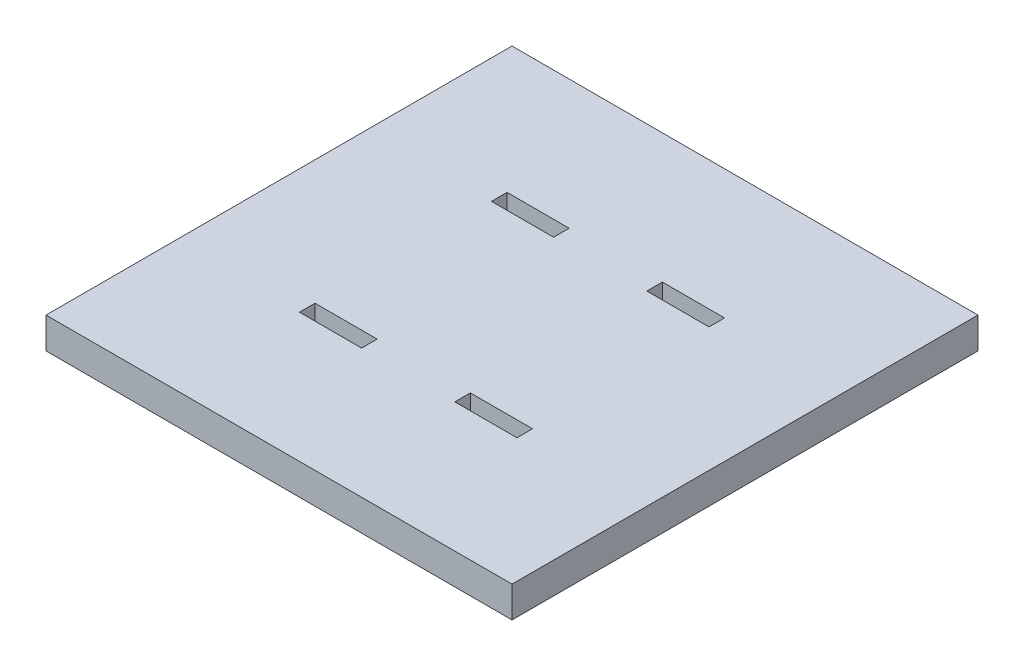
ISO-10303-21;
HEADER;
FILE_DESCRIPTION(('STEP AP214'),'2;1');
FILE_NAME('part.step','',(''),(''),'','','');
FILE_SCHEMA(('AUTOMOTIVE_DESIGN { 1 0 10303 214 1 1 1 1 }'));
ENDSEC;
DATA;
#1=APPLICATION_CONTEXT('core data for automotive mechanical design processes');
#2=APPLICATION_PROTOCOL_DEFINITION('international standard','automotive_design',2000,#1);
#3=PRODUCT_CONTEXT('',#1,'mechanical');
#4=PRODUCT('Part','Part','',(#3));
#5=PRODUCT_RELATED_PRODUCT_CATEGORY('part','',(#4));
#6=PRODUCT_DEFINITION_FORMATION('','',#4);
#7=PRODUCT_DEFINITION_CONTEXT('part definition',#1,'design');
#8=PRODUCT_DEFINITION('design','',#6,#7);
#9=PRODUCT_DEFINITION_SHAPE('','',#8);
#10=(LENGTH_UNIT() NAMED_UNIT(*) SI_UNIT(.MILLI.,.METRE.));
#11=(NAMED_UNIT(*) PLANE_ANGLE_UNIT() SI_UNIT($,.RADIAN.));
#12=(NAMED_UNIT(*) SI_UNIT($,.STERADIAN.) SOLID_ANGLE_UNIT());
#13=UNCERTAINTY_MEASURE_WITH_UNIT(LENGTH_MEASURE(1.E-05),#10,'distance_accuracy_value','');
#14=(GEOMETRIC_REPRESENTATION_CONTEXT(3) GLOBAL_UNCERTAINTY_ASSIGNED_CONTEXT((#13)) GLOBAL_UNIT_ASSIGNED_CONTEXT((#10,
#11,#12)) REPRESENTATION_CONTEXT('',''));
#15=CARTESIAN_POINT('',(0.,0.,0.));
#16=DIRECTION('',(0.,0.,1.));
#17=DIRECTION('',(1.,0.,0.));
#18=AXIS2_PLACEMENT_3D('',#15,#16,#17);
#19=CARTESIAN_POINT('',(0.,-69.38,0.));
#20=DIRECTION('',(0.,1.,0.));
#21=DIRECTION('',(0.,0.,1.));
#22=AXIS2_PLACEMENT_3D('',#19,#20,#21);
#23=PLANE('',#22);
#24=DIRECTION('',(0.,0.,1.));
#25=VECTOR('',#24,1.);
#26=CARTESIAN_POINT('',(-75.,-69.38,75.));
#27=LINE('',#26,#25);
#28=CARTESIAN_POINT('',(-75.,-69.38,-75.));
#29=VERTEX_POINT('',#28);
#30=CARTESIAN_POINT('',(-75.,-69.38,75.));
#31=VERTEX_POINT('',#30);
#32=EDGE_CURVE('E299',#29,#31,#27,.T.);
#33=ORIENTED_EDGE('',*,*,#32,.T.);
#34=DIRECTION('',(1.,0.,0.));
#35=VECTOR('',#34,1.);
#36=CARTESIAN_POINT('',(75.,-69.38,75.));
#37=LINE('',#36,#35);
#38=CARTESIAN_POINT('',(75.,-69.38,75.));
#39=VERTEX_POINT('',#38);
#40=EDGE_CURVE('E302',#31,#39,#37,.T.);
#41=ORIENTED_EDGE('',*,*,#40,.T.);
#42=DIRECTION('',(0.,0.,-1.));
#43=VECTOR('',#42,1.);
#44=CARTESIAN_POINT('',(75.,-69.38,75.));
#45=LINE('',#44,#43);
#46=CARTESIAN_POINT('',(75.,-69.38,-75.));
#47=VERTEX_POINT('',#46);
#48=EDGE_CURVE('E305',#39,#47,#45,.T.);
#49=ORIENTED_EDGE('',*,*,#48,.T.);
#50=DIRECTION('',(-1.,0.,0.));
#51=VECTOR('',#50,1.);
#52=CARTESIAN_POINT('',(75.,-69.38,-75.));
#53=LINE('',#52,#51);
#54=EDGE_CURVE('E307',#47,#29,#53,.T.);
#55=ORIENTED_EDGE('',*,*,#54,.T.);
#56=EDGE_LOOP('',(#33,#41,#49,#55));
#57=FACE_BOUND('',#56,.T.);
#58=DIRECTION('',(1.,0.,0.));
#59=VECTOR('',#58,1.);
#60=CARTESIAN_POINT('',(-35.,-69.38,33.4));
#61=LINE('',#60,#59);
#62=CARTESIAN_POINT('',(-35.,-69.38,33.4));
#63=VERTEX_POINT('',#62);
#64=CARTESIAN_POINT('',(-15.,-69.38,33.4));
#65=VERTEX_POINT('',#64);
#66=EDGE_CURVE('E270',#63,#65,#61,.T.);
#67=ORIENTED_EDGE('',*,*,#66,.F.);
#68=DIRECTION('',(0.,0.,1.));
#69=VECTOR('',#68,1.);
#70=CARTESIAN_POINT('',(-35.,-69.38,28.4));
#71=LINE('',#70,#69);
#72=CARTESIAN_POINT('',(-35.,-69.38,28.4));
#73=VERTEX_POINT('',#72);
#74=EDGE_CURVE('E268',#73,#63,#71,.T.);
#75=ORIENTED_EDGE('',*,*,#74,.F.);
#76=DIRECTION('',(-1.,0.,0.));
#77=VECTOR('',#76,1.);
#78=CARTESIAN_POINT('',(-35.,-69.38,28.4));
#79=LINE('',#78,#77);
#80=CARTESIAN_POINT('',(-15.,-69.38,28.4));
#81=VERTEX_POINT('',#80);
#82=EDGE_CURVE('E276',#81,#73,#79,.T.);
#83=ORIENTED_EDGE('',*,*,#82,.F.);
#84=DIRECTION('',(0.,0.,-1.));
#85=VECTOR('',#84,1.);
#86=CARTESIAN_POINT('',(-15.,-69.38,28.4));
#87=LINE('',#86,#85);
#88=EDGE_CURVE('E273',#65,#81,#87,.T.);
#89=ORIENTED_EDGE('',*,*,#88,.F.);
#90=EDGE_LOOP('',(#67,#75,#83,#89));
#91=FACE_BOUND('',#90,.T.);
#92=DIRECTION('',(1.,0.,0.));
#93=VECTOR('',#92,1.);
#94=CARTESIAN_POINT('',(15.,-69.38,33.4));
#95=LINE('',#94,#93);
#96=CARTESIAN_POINT('',(15.,-69.38,33.4));
#97=VERTEX_POINT('',#96);
#98=CARTESIAN_POINT('',(35.,-69.38,33.4));
#99=VERTEX_POINT('',#98);
#100=EDGE_CURVE('E239',#97,#99,#95,.T.);
#101=ORIENTED_EDGE('',*,*,#100,.F.);
#102=DIRECTION('',(0.,0.,1.));
#103=VECTOR('',#102,1.);
#104=CARTESIAN_POINT('',(15.,-69.38,28.4));
#105=LINE('',#104,#103);
#106=CARTESIAN_POINT('',(15.,-69.38,28.4));
#107=VERTEX_POINT('',#106);
#108=EDGE_CURVE('E237',#107,#97,#105,.T.);
#109=ORIENTED_EDGE('',*,*,#108,.F.);
#110=DIRECTION('',(-1.,0.,0.));
#111=VECTOR('',#110,1.);
#112=CARTESIAN_POINT('',(15.,-69.38,28.4));
#113=LINE('',#112,#111);
#114=CARTESIAN_POINT('',(35.,-69.38,28.4));
#115=VERTEX_POINT('',#114);
#116=EDGE_CURVE('E245',#115,#107,#113,.T.);
#117=ORIENTED_EDGE('',*,*,#116,.F.);
#118=DIRECTION('',(0.,0.,-1.));
#119=VECTOR('',#118,1.);
#120=CARTESIAN_POINT('',(35.,-69.38,28.4));
#121=LINE('',#120,#119);
#122=EDGE_CURVE('E242',#99,#115,#121,.T.);
#123=ORIENTED_EDGE('',*,*,#122,.F.);
#124=EDGE_LOOP('',(#101,#109,#117,#123));
#125=FACE_BOUND('',#124,.T.);
#126=DIRECTION('',(1.,0.,0.));
#127=VECTOR('',#126,1.);
#128=CARTESIAN_POINT('',(15.,-69.38,-28.4));
#129=LINE('',#128,#127);
#130=CARTESIAN_POINT('',(15.,-69.38,-28.4));
#131=VERTEX_POINT('',#130);
#132=CARTESIAN_POINT('',(35.,-69.38,-28.4));
#133=VERTEX_POINT('',#132);
#134=EDGE_CURVE('E208',#131,#133,#129,.T.);
#135=ORIENTED_EDGE('',*,*,#134,.F.);
#136=DIRECTION('',(0.,0.,1.));
#137=VECTOR('',#136,1.);
#138=CARTESIAN_POINT('',(15.,-69.38,-28.4));
#139=LINE('',#138,#137);
#140=CARTESIAN_POINT('',(15.,-69.38,-33.4));
#141=VERTEX_POINT('',#140);
#142=EDGE_CURVE('E206',#141,#131,#139,.T.);
#143=ORIENTED_EDGE('',*,*,#142,.F.);
#144=DIRECTION('',(-1.,0.,0.));
#145=VECTOR('',#144,1.);
#146=CARTESIAN_POINT('',(15.,-69.38,-33.4));
#147=LINE('',#146,#145);
#148=CARTESIAN_POINT('',(35.,-69.38,-33.4));
#149=VERTEX_POINT('',#148);
#150=EDGE_CURVE('E214',#149,#141,#147,.T.);
#151=ORIENTED_EDGE('',*,*,#150,.F.);
#152=DIRECTION('',(0.,0.,-1.));
#153=VECTOR('',#152,1.);
#154=CARTESIAN_POINT('',(35.,-69.38,-28.4));
#155=LINE('',#154,#153);
#156=EDGE_CURVE('E211',#133,#149,#155,.T.);
#157=ORIENTED_EDGE('',*,*,#156,.F.);
#158=EDGE_LOOP('',(#135,#143,#151,#157));
#159=FACE_BOUND('',#158,.T.);
#160=DIRECTION('',(1.,0.,0.));
#161=VECTOR('',#160,1.);
#162=CARTESIAN_POINT('',(-35.,-69.38,-28.4));
#163=LINE('',#162,#161);
#164=CARTESIAN_POINT('',(-35.,-69.38,-28.4));
#165=VERTEX_POINT('',#164);
#166=CARTESIAN_POINT('',(-15.,-69.38,-28.4));
#167=VERTEX_POINT('',#166);
#168=EDGE_CURVE('E178',#165,#167,#163,.T.);
#169=ORIENTED_EDGE('',*,*,#168,.F.);
#170=DIRECTION('',(0.,0.,1.));
#171=VECTOR('',#170,1.);
#172=CARTESIAN_POINT('',(-35.,-69.38,-28.4));
#173=LINE('',#172,#171);
#174=CARTESIAN_POINT('',(-35.,-69.38,-33.4));
#175=VERTEX_POINT('',#174);
#176=EDGE_CURVE('E170',#175,#165,#173,.T.);
#177=ORIENTED_EDGE('',*,*,#176,.F.);
#178=DIRECTION('',(-1.,0.,0.));
#179=VECTOR('',#178,1.);
#180=CARTESIAN_POINT('',(-35.,-69.38,-33.4));
#181=LINE('',#180,#179);
#182=CARTESIAN_POINT('',(-15.,-69.38,-33.4));
#183=VERTEX_POINT('',#182);
#184=EDGE_CURVE('E192',#183,#175,#181,.T.);
#185=ORIENTED_EDGE('',*,*,#184,.F.);
#186=DIRECTION('',(0.,0.,-1.));
#187=VECTOR('',#186,1.);
#188=CARTESIAN_POINT('',(-15.,-69.38,-28.4));
#189=LINE('',#188,#187);
#190=EDGE_CURVE('E190',#167,#183,#189,.T.);
#191=ORIENTED_EDGE('',*,*,#190,.F.);
#192=EDGE_LOOP('',(#169,#177,#185,#191));
#193=FACE_BOUND('',#192,.T.);
#194=ADVANCED_FACE('F33',(#57,#91,#125,#159,#193),#23,.T.);
#195=CARTESIAN_POINT('',(0.,-79.38,0.));
#196=DIRECTION('',(0.,1.,0.));
#197=DIRECTION('',(0.,0.,1.));
#198=AXIS2_PLACEMENT_3D('',#195,#196,#197);
#199=PLANE('',#198);
#200=DIRECTION('',(0.,0.,1.));
#201=VECTOR('',#200,1.);
#202=CARTESIAN_POINT('',(15.,-79.38,-28.4));
#203=LINE('',#202,#201);
#204=CARTESIAN_POINT('',(15.,-79.38,-33.4));
#205=VERTEX_POINT('',#204);
#206=CARTESIAN_POINT('',(15.,-79.38,-28.4));
#207=VERTEX_POINT('',#206);
#208=EDGE_CURVE('E186',#205,#207,#203,.T.);
#209=ORIENTED_EDGE('',*,*,#208,.T.);
#210=DIRECTION('',(1.,0.,0.));
#211=VECTOR('',#210,1.);
#212=CARTESIAN_POINT('',(15.,-79.38,-28.4));
#213=LINE('',#212,#211);
#214=CARTESIAN_POINT('',(35.,-79.38,-28.4));
#215=VERTEX_POINT('',#214);
#216=EDGE_CURVE('E219',#207,#215,#213,.T.);
#217=ORIENTED_EDGE('',*,*,#216,.T.);
#218=DIRECTION('',(0.,0.,-1.));
#219=VECTOR('',#218,1.);
#220=CARTESIAN_POINT('',(35.,-79.38,-28.4));
#221=LINE('',#220,#219);
#222=CARTESIAN_POINT('',(35.,-79.38,-33.4));
#223=VERTEX_POINT('',#222);
#224=EDGE_CURVE('E222',#215,#223,#221,.T.);
#225=ORIENTED_EDGE('',*,*,#224,.T.);
#226=DIRECTION('',(-1.,0.,0.));
#227=VECTOR('',#226,1.);
#228=CARTESIAN_POINT('',(15.,-79.38,-33.4));
#229=LINE('',#228,#227);
#230=EDGE_CURVE('E209',#223,#205,#229,.T.);
#231=ORIENTED_EDGE('',*,*,#230,.T.);
#232=EDGE_LOOP('',(#209,#217,#225,#231));
#233=FACE_BOUND('',#232,.T.);
#234=DIRECTION('',(0.,0.,1.));
#235=VECTOR('',#234,1.);
#236=CARTESIAN_POINT('',(-35.,-79.38,28.4));
#237=LINE('',#236,#235);
#238=CARTESIAN_POINT('',(-35.,-79.38,28.4));
#239=VERTEX_POINT('',#238);
#240=CARTESIAN_POINT('',(-35.,-79.38,33.4));
#241=VERTEX_POINT('',#240);
#242=EDGE_CURVE('E267',#239,#241,#237,.T.);
#243=ORIENTED_EDGE('',*,*,#242,.T.);
#244=DIRECTION('',(1.,0.,0.));
#245=VECTOR('',#244,1.);
#246=CARTESIAN_POINT('',(-35.,-79.38,33.4));
#247=LINE('',#246,#245);
#248=CARTESIAN_POINT('',(-15.,-79.38,33.4));
#249=VERTEX_POINT('',#248);
#250=EDGE_CURVE('E281',#241,#249,#247,.T.);
#251=ORIENTED_EDGE('',*,*,#250,.T.);
#252=DIRECTION('',(0.,0.,-1.));
#253=VECTOR('',#252,1.);
#254=CARTESIAN_POINT('',(-15.,-79.38,28.4));
#255=LINE('',#254,#253);
#256=CARTESIAN_POINT('',(-15.,-79.38,28.4));
#257=VERTEX_POINT('',#256);
#258=EDGE_CURVE('E284',#249,#257,#255,.T.);
#259=ORIENTED_EDGE('',*,*,#258,.T.);
#260=DIRECTION('',(-1.,0.,0.));
#261=VECTOR('',#260,1.);
#262=CARTESIAN_POINT('',(-35.,-79.38,28.4));
#263=LINE('',#262,#261);
#264=EDGE_CURVE('E271',#257,#239,#263,.T.);
#265=ORIENTED_EDGE('',*,*,#264,.T.);
#266=EDGE_LOOP('',(#243,#251,#259,#265));
#267=FACE_BOUND('',#266,.T.);
#268=DIRECTION('',(0.,0.,1.));
#269=VECTOR('',#268,1.);
#270=CARTESIAN_POINT('',(-75.,-79.38,75.));
#271=LINE('',#270,#269);
#272=CARTESIAN_POINT('',(-75.,-79.38,-75.));
#273=VERTEX_POINT('',#272);
#274=CARTESIAN_POINT('',(-75.,-79.38,75.));
#275=VERTEX_POINT('',#274);
#276=EDGE_CURVE('E298',#273,#275,#271,.T.);
#277=ORIENTED_EDGE('',*,*,#276,.F.);
#278=DIRECTION('',(-1.,0.,0.));
#279=VECTOR('',#278,1.);
#280=CARTESIAN_POINT('',(75.,-79.38,-75.));
#281=LINE('',#280,#279);
#282=CARTESIAN_POINT('',(75.,-79.38,-75.));
#283=VERTEX_POINT('',#282);
#284=EDGE_CURVE('E303',#283,#273,#281,.T.);
#285=ORIENTED_EDGE('',*,*,#284,.F.);
#286=DIRECTION('',(0.,0.,-1.));
#287=VECTOR('',#286,1.);
#288=CARTESIAN_POINT('',(75.,-79.38,75.));
#289=LINE('',#288,#287);
#290=CARTESIAN_POINT('',(75.,-79.38,75.));
#291=VERTEX_POINT('',#290);
#292=EDGE_CURVE('E314',#291,#283,#289,.T.);
#293=ORIENTED_EDGE('',*,*,#292,.F.);
#294=DIRECTION('',(1.,0.,0.));
#295=VECTOR('',#294,1.);
#296=CARTESIAN_POINT('',(75.,-79.38,75.));
#297=LINE('',#296,#295);
#298=EDGE_CURVE('E312',#275,#291,#297,.T.);
#299=ORIENTED_EDGE('',*,*,#298,.F.);
#300=EDGE_LOOP('',(#277,#285,#293,#299));
#301=FACE_BOUND('',#300,.T.);
#302=DIRECTION('',(0.,0.,1.));
#303=VECTOR('',#302,1.);
#304=CARTESIAN_POINT('',(15.,-79.38,28.4));
#305=LINE('',#304,#303);
#306=CARTESIAN_POINT('',(15.,-79.38,28.4));
#307=VERTEX_POINT('',#306);
#308=CARTESIAN_POINT('',(15.,-79.38,33.4));
#309=VERTEX_POINT('',#308);
#310=EDGE_CURVE('E236',#307,#309,#305,.T.);
#311=ORIENTED_EDGE('',*,*,#310,.T.);
#312=DIRECTION('',(1.,0.,0.));
#313=VECTOR('',#312,1.);
#314=CARTESIAN_POINT('',(15.,-79.38,33.4));
#315=LINE('',#314,#313);
#316=CARTESIAN_POINT('',(35.,-79.38,33.4));
#317=VERTEX_POINT('',#316);
#318=EDGE_CURVE('E250',#309,#317,#315,.T.);
#319=ORIENTED_EDGE('',*,*,#318,.T.);
#320=DIRECTION('',(0.,0.,-1.));
#321=VECTOR('',#320,1.);
#322=CARTESIAN_POINT('',(35.,-79.38,28.4));
#323=LINE('',#322,#321);
#324=CARTESIAN_POINT('',(35.,-79.38,28.4));
#325=VERTEX_POINT('',#324);
#326=EDGE_CURVE('E253',#317,#325,#323,.T.);
#327=ORIENTED_EDGE('',*,*,#326,.T.);
#328=DIRECTION('',(-1.,0.,0.));
#329=VECTOR('',#328,1.);
#330=CARTESIAN_POINT('',(15.,-79.38,28.4));
#331=LINE('',#330,#329);
#332=EDGE_CURVE('E240',#325,#307,#331,.T.);
#333=ORIENTED_EDGE('',*,*,#332,.T.);
#334=EDGE_LOOP('',(#311,#319,#327,#333));
#335=FACE_BOUND('',#334,.T.);
#336=DIRECTION('',(0.,0.,1.));
#337=VECTOR('',#336,1.);
#338=CARTESIAN_POINT('',(-35.,-79.38,-28.4));
#339=LINE('',#338,#337);
#340=CARTESIAN_POINT('',(-35.,-79.38,-33.4));
#341=VERTEX_POINT('',#340);
#342=CARTESIAN_POINT('',(-35.,-79.38,-28.4));
#343=VERTEX_POINT('',#342);
#344=EDGE_CURVE('E56',#341,#343,#339,.T.);
#345=ORIENTED_EDGE('',*,*,#344,.T.);
#346=DIRECTION('',(1.,0.,0.));
#347=VECTOR('',#346,1.);
#348=CARTESIAN_POINT('',(-35.,-79.38,-28.4));
#349=LINE('',#348,#347);
#350=CARTESIAN_POINT('',(-15.,-79.38,-28.4));
#351=VERTEX_POINT('',#350);
#352=EDGE_CURVE('E185',#343,#351,#349,.T.);
#353=ORIENTED_EDGE('',*,*,#352,.T.);
#354=DIRECTION('',(0.,0.,-1.));
#355=VECTOR('',#354,1.);
#356=CARTESIAN_POINT('',(-15.,-79.38,-28.4));
#357=LINE('',#356,#355);
#358=CARTESIAN_POINT('',(-15.,-79.38,-33.4));
#359=VERTEX_POINT('',#358);
#360=EDGE_CURVE('E198',#351,#359,#357,.T.);
#361=ORIENTED_EDGE('',*,*,#360,.T.);
#362=DIRECTION('',(-1.,0.,0.));
#363=VECTOR('',#362,1.);
#364=CARTESIAN_POINT('',(-35.,-79.38,-33.4));
#365=LINE('',#364,#363);
#366=EDGE_CURVE('E179',#359,#341,#365,.T.);
#367=ORIENTED_EDGE('',*,*,#366,.T.);
#368=EDGE_LOOP('',(#345,#353,#361,#367));
#369=FACE_BOUND('',#368,.T.);
#370=ADVANCED_FACE('F332',(#233,#267,#301,#335,#369),#199,.F.);
#371=CARTESIAN_POINT('',(-75.,-69.38,75.));
#372=DIRECTION('',(1.,0.,0.));
#373=DIRECTION('',(0.,0.,-1.));
#374=AXIS2_PLACEMENT_3D('',#371,#372,#373);
#375=PLANE('',#374);
#376=ORIENTED_EDGE('',*,*,#276,.T.);
#377=DIRECTION('',(0.,-1.,0.));
#378=VECTOR('',#377,1.);
#379=CARTESIAN_POINT('',(-75.,-69.38,75.));
#380=LINE('',#379,#378);
#381=EDGE_CURVE('E11',#31,#275,#380,.T.);
#382=ORIENTED_EDGE('',*,*,#381,.F.);
#383=ORIENTED_EDGE('',*,*,#32,.F.);
#384=DIRECTION('',(0.,-1.,0.));
#385=VECTOR('',#384,1.);
#386=CARTESIAN_POINT('',(-75.,-69.38,-75.));
#387=LINE('',#386,#385);
#388=EDGE_CURVE('E309',#29,#273,#387,.T.);
#389=ORIENTED_EDGE('',*,*,#388,.T.);
#390=EDGE_LOOP('',(#376,#382,#383,#389));
#391=FACE_BOUND('',#390,.T.);
#392=ADVANCED_FACE('F35',(#391),#375,.F.);
#393=CARTESIAN_POINT('',(75.,-69.38,75.));
#394=DIRECTION('',(0.,0.,-1.));
#395=DIRECTION('',(-1.,0.,0.));
#396=AXIS2_PLACEMENT_3D('',#393,#394,#395);
#397=PLANE('',#396);
#398=ORIENTED_EDGE('',*,*,#298,.T.);
#399=DIRECTION('',(0.,-1.,0.));
#400=VECTOR('',#399,1.);
#401=CARTESIAN_POINT('',(75.,-69.38,75.));
#402=LINE('',#401,#400);
#403=EDGE_CURVE('E41',#39,#291,#402,.T.);
#404=ORIENTED_EDGE('',*,*,#403,.F.);
#405=ORIENTED_EDGE('',*,*,#40,.F.);
#406=ORIENTED_EDGE('',*,*,#381,.T.);
#407=EDGE_LOOP('',(#398,#404,#405,#406));
#408=FACE_BOUND('',#407,.T.);
#409=ADVANCED_FACE('F343',(#408),#397,.F.);
#410=CARTESIAN_POINT('',(75.,-69.38,75.));
#411=DIRECTION('',(-1.,0.,0.));
#412=DIRECTION('',(0.,0.,1.));
#413=AXIS2_PLACEMENT_3D('',#410,#411,#412);
#414=PLANE('',#413);
#415=ORIENTED_EDGE('',*,*,#292,.T.);
#416=DIRECTION('',(0.,-1.,0.));
#417=VECTOR('',#416,1.);
#418=CARTESIAN_POINT('',(75.,-69.38,-75.));
#419=LINE('',#418,#417);
#420=EDGE_CURVE('E319',#47,#283,#419,.T.);
#421=ORIENTED_EDGE('',*,*,#420,.F.);
#422=ORIENTED_EDGE('',*,*,#48,.F.);
#423=ORIENTED_EDGE('',*,*,#403,.T.);
#424=EDGE_LOOP('',(#415,#421,#422,#423));
#425=FACE_BOUND('',#424,.T.);
#426=ADVANCED_FACE('F326',(#425),#414,.F.);
#427=CARTESIAN_POINT('',(75.,-69.38,-75.));
#428=DIRECTION('',(0.,0.,1.));
#429=DIRECTION('',(1.,0.,0.));
#430=AXIS2_PLACEMENT_3D('',#427,#428,#429);
#431=PLANE('',#430);
#432=ORIENTED_EDGE('',*,*,#284,.T.);
#433=ORIENTED_EDGE('',*,*,#388,.F.);
#434=ORIENTED_EDGE('',*,*,#54,.F.);
#435=ORIENTED_EDGE('',*,*,#420,.T.);
#436=EDGE_LOOP('',(#432,#433,#434,#435));
#437=FACE_BOUND('',#436,.T.);
#438=ADVANCED_FACE('F336',(#437),#431,.F.);
#439=CARTESIAN_POINT('',(-35.,-69.38,28.4));
#440=DIRECTION('',(1.,0.,0.));
#441=DIRECTION('',(0.,0.,-1.));
#442=AXIS2_PLACEMENT_3D('',#439,#440,#441);
#443=PLANE('',#442);
#444=ORIENTED_EDGE('',*,*,#242,.F.);
#445=DIRECTION('',(0.,-1.,0.));
#446=VECTOR('',#445,1.);
#447=CARTESIAN_POINT('',(-35.,-69.38,28.4));
#448=LINE('',#447,#446);
#449=EDGE_CURVE('E278',#73,#239,#448,.T.);
#450=ORIENTED_EDGE('',*,*,#449,.F.);
#451=ORIENTED_EDGE('',*,*,#74,.T.);
#452=DIRECTION('',(0.,-1.,0.));
#453=VECTOR('',#452,1.);
#454=CARTESIAN_POINT('',(-35.,-69.38,33.4));
#455=LINE('',#454,#453);
#456=EDGE_CURVE('E295',#63,#241,#455,.T.);
#457=ORIENTED_EDGE('',*,*,#456,.T.);
#458=EDGE_LOOP('',(#444,#450,#451,#457));
#459=FACE_BOUND('',#458,.T.);
#460=ADVANCED_FACE('F358',(#459),#443,.T.);
#461=CARTESIAN_POINT('',(-35.,-69.38,33.4));
#462=DIRECTION('',(0.,0.,-1.));
#463=DIRECTION('',(-1.,0.,0.));
#464=AXIS2_PLACEMENT_3D('',#461,#462,#463);
#465=PLANE('',#464);
#466=ORIENTED_EDGE('',*,*,#250,.F.);
#467=ORIENTED_EDGE('',*,*,#456,.F.);
#468=ORIENTED_EDGE('',*,*,#66,.T.);
#469=DIRECTION('',(0.,-1.,0.));
#470=VECTOR('',#469,1.);
#471=CARTESIAN_POINT('',(-15.,-69.38,33.4));
#472=LINE('',#471,#470);
#473=EDGE_CURVE('E293',#65,#249,#472,.T.);
#474=ORIENTED_EDGE('',*,*,#473,.T.);
#475=EDGE_LOOP('',(#466,#467,#468,#474));
#476=FACE_BOUND('',#475,.T.);
#477=ADVANCED_FACE('F365',(#476),#465,.T.);
#478=CARTESIAN_POINT('',(-15.,-69.38,28.4));
#479=DIRECTION('',(-1.,0.,0.));
#480=DIRECTION('',(0.,0.,1.));
#481=AXIS2_PLACEMENT_3D('',#478,#479,#480);
#482=PLANE('',#481);
#483=ORIENTED_EDGE('',*,*,#258,.F.);
#484=ORIENTED_EDGE('',*,*,#473,.F.);
#485=ORIENTED_EDGE('',*,*,#88,.T.);
#486=DIRECTION('',(0.,-1.,0.));
#487=VECTOR('',#486,1.);
#488=CARTESIAN_POINT('',(-15.,-69.38,28.4));
#489=LINE('',#488,#487);
#490=EDGE_CURVE('E291',#81,#257,#489,.T.);
#491=ORIENTED_EDGE('',*,*,#490,.T.);
#492=EDGE_LOOP('',(#483,#484,#485,#491));
#493=FACE_BOUND('',#492,.T.);
#494=ADVANCED_FACE('F370',(#493),#482,.T.);
#495=CARTESIAN_POINT('',(-35.,-69.38,28.4));
#496=DIRECTION('',(0.,0.,1.));
#497=DIRECTION('',(1.,0.,0.));
#498=AXIS2_PLACEMENT_3D('',#495,#496,#497);
#499=PLANE('',#498);
#500=ORIENTED_EDGE('',*,*,#264,.F.);
#501=ORIENTED_EDGE('',*,*,#490,.F.);
#502=ORIENTED_EDGE('',*,*,#82,.T.);
#503=ORIENTED_EDGE('',*,*,#449,.T.);
#504=EDGE_LOOP('',(#500,#501,#502,#503));
#505=FACE_BOUND('',#504,.T.);
#506=ADVANCED_FACE('F378',(#505),#499,.T.);
#507=CARTESIAN_POINT('',(15.,-69.38,28.4));
#508=DIRECTION('',(1.,0.,0.));
#509=DIRECTION('',(0.,0.,-1.));
#510=AXIS2_PLACEMENT_3D('',#507,#508,#509);
#511=PLANE('',#510);
#512=ORIENTED_EDGE('',*,*,#310,.F.);
#513=DIRECTION('',(0.,-1.,0.));
#514=VECTOR('',#513,1.);
#515=CARTESIAN_POINT('',(15.,-69.38,28.4));
#516=LINE('',#515,#514);
#517=EDGE_CURVE('E247',#107,#307,#516,.T.);
#518=ORIENTED_EDGE('',*,*,#517,.F.);
#519=ORIENTED_EDGE('',*,*,#108,.T.);
#520=DIRECTION('',(0.,-1.,0.));
#521=VECTOR('',#520,1.);
#522=CARTESIAN_POINT('',(15.,-69.38,33.4));
#523=LINE('',#522,#521);
#524=EDGE_CURVE('E264',#97,#309,#523,.T.);
#525=ORIENTED_EDGE('',*,*,#524,.T.);
#526=EDGE_LOOP('',(#512,#518,#519,#525));
#527=FACE_BOUND('',#526,.T.);
#528=ADVANCED_FACE('F432',(#527),#511,.T.);
#529=CARTESIAN_POINT('',(15.,-69.38,33.4));
#530=DIRECTION('',(0.,0.,-1.));
#531=DIRECTION('',(-1.,0.,0.));
#532=AXIS2_PLACEMENT_3D('',#529,#530,#531);
#533=PLANE('',#532);
#534=ORIENTED_EDGE('',*,*,#318,.F.);
#535=ORIENTED_EDGE('',*,*,#524,.F.);
#536=ORIENTED_EDGE('',*,*,#100,.T.);
#537=DIRECTION('',(0.,-1.,0.));
#538=VECTOR('',#537,1.);
#539=CARTESIAN_POINT('',(35.,-69.38,33.4));
#540=LINE('',#539,#538);
#541=EDGE_CURVE('E262',#99,#317,#540,.T.);
#542=ORIENTED_EDGE('',*,*,#541,.T.);
#543=EDGE_LOOP('',(#534,#535,#536,#542));
#544=FACE_BOUND('',#543,.T.);
#545=ADVANCED_FACE('F428',(#544),#533,.T.);
#546=CARTESIAN_POINT('',(35.,-69.38,28.4));
#547=DIRECTION('',(-1.,0.,0.));
#548=DIRECTION('',(0.,0.,1.));
#549=AXIS2_PLACEMENT_3D('',#546,#547,#548);
#550=PLANE('',#549);
#551=ORIENTED_EDGE('',*,*,#326,.F.);
#552=ORIENTED_EDGE('',*,*,#541,.F.);
#553=ORIENTED_EDGE('',*,*,#122,.T.);
#554=DIRECTION('',(0.,-1.,0.));
#555=VECTOR('',#554,1.);
#556=CARTESIAN_POINT('',(35.,-69.38,28.4));
#557=LINE('',#556,#555);
#558=EDGE_CURVE('E260',#115,#325,#557,.T.);
#559=ORIENTED_EDGE('',*,*,#558,.T.);
#560=EDGE_LOOP('',(#551,#552,#553,#559));
#561=FACE_BOUND('',#560,.T.);
#562=ADVANCED_FACE('F424',(#561),#550,.T.);
#563=CARTESIAN_POINT('',(15.,-69.38,28.4));
#564=DIRECTION('',(0.,0.,1.));
#565=DIRECTION('',(1.,0.,0.));
#566=AXIS2_PLACEMENT_3D('',#563,#564,#565);
#567=PLANE('',#566);
#568=ORIENTED_EDGE('',*,*,#332,.F.);
#569=ORIENTED_EDGE('',*,*,#558,.F.);
#570=ORIENTED_EDGE('',*,*,#116,.T.);
#571=ORIENTED_EDGE('',*,*,#517,.T.);
#572=EDGE_LOOP('',(#568,#569,#570,#571));
#573=FACE_BOUND('',#572,.T.);
#574=ADVANCED_FACE('F421',(#573),#567,.T.);
#575=CARTESIAN_POINT('',(15.,-69.38,-28.4));
#576=DIRECTION('',(1.,0.,0.));
#577=DIRECTION('',(0.,0.,-1.));
#578=AXIS2_PLACEMENT_3D('',#575,#576,#577);
#579=PLANE('',#578);
#580=ORIENTED_EDGE('',*,*,#208,.F.);
#581=DIRECTION('',(0.,-1.,0.));
#582=VECTOR('',#581,1.);
#583=CARTESIAN_POINT('',(15.,-69.38,-33.4));
#584=LINE('',#583,#582);
#585=EDGE_CURVE('E216',#141,#205,#584,.T.);
#586=ORIENTED_EDGE('',*,*,#585,.F.);
#587=ORIENTED_EDGE('',*,*,#142,.T.);
#588=DIRECTION('',(0.,-1.,0.));
#589=VECTOR('',#588,1.);
#590=CARTESIAN_POINT('',(15.,-69.38,-28.4));
#591=LINE('',#590,#589);
#592=EDGE_CURVE('E233',#131,#207,#591,.T.);
#593=ORIENTED_EDGE('',*,*,#592,.T.);
#594=EDGE_LOOP('',(#580,#586,#587,#593));
#595=FACE_BOUND('',#594,.T.);
#596=ADVANCED_FACE('F403',(#595),#579,.T.);
#597=CARTESIAN_POINT('',(15.,-69.38,-28.4));
#598=DIRECTION('',(0.,0.,-1.));
#599=DIRECTION('',(-1.,0.,0.));
#600=AXIS2_PLACEMENT_3D('',#597,#598,#599);
#601=PLANE('',#600);
#602=ORIENTED_EDGE('',*,*,#216,.F.);
#603=ORIENTED_EDGE('',*,*,#592,.F.);
#604=ORIENTED_EDGE('',*,*,#134,.T.);
#605=DIRECTION('',(0.,-1.,0.));
#606=VECTOR('',#605,1.);
#607=CARTESIAN_POINT('',(35.,-69.38,-28.4));
#608=LINE('',#607,#606);
#609=EDGE_CURVE('E231',#133,#215,#608,.T.);
#610=ORIENTED_EDGE('',*,*,#609,.T.);
#611=EDGE_LOOP('',(#602,#603,#604,#610));
#612=FACE_BOUND('',#611,.T.);
#613=ADVANCED_FACE('F397',(#612),#601,.T.);
#614=CARTESIAN_POINT('',(35.,-69.38,-28.4));
#615=DIRECTION('',(-1.,0.,0.));
#616=DIRECTION('',(0.,0.,1.));
#617=AXIS2_PLACEMENT_3D('',#614,#615,#616);
#618=PLANE('',#617);
#619=ORIENTED_EDGE('',*,*,#224,.F.);
#620=ORIENTED_EDGE('',*,*,#609,.F.);
#621=ORIENTED_EDGE('',*,*,#156,.T.);
#622=DIRECTION('',(0.,-1.,0.));
#623=VECTOR('',#622,1.);
#624=CARTESIAN_POINT('',(35.,-69.38,-33.4));
#625=LINE('',#624,#623);
#626=EDGE_CURVE('E229',#149,#223,#625,.T.);
#627=ORIENTED_EDGE('',*,*,#626,.T.);
#628=EDGE_LOOP('',(#619,#620,#621,#627));
#629=FACE_BOUND('',#628,.T.);
#630=ADVANCED_FACE('F400',(#629),#618,.T.);
#631=CARTESIAN_POINT('',(15.,-69.38,-33.4));
#632=DIRECTION('',(0.,0.,1.));
#633=DIRECTION('',(1.,0.,0.));
#634=AXIS2_PLACEMENT_3D('',#631,#632,#633);
#635=PLANE('',#634);
#636=ORIENTED_EDGE('',*,*,#230,.F.);
#637=ORIENTED_EDGE('',*,*,#626,.F.);
#638=ORIENTED_EDGE('',*,*,#150,.T.);
#639=ORIENTED_EDGE('',*,*,#585,.T.);
#640=EDGE_LOOP('',(#636,#637,#638,#639));
#641=FACE_BOUND('',#640,.T.);
#642=ADVANCED_FACE('F406',(#641),#635,.T.);
#643=CARTESIAN_POINT('',(-35.,-69.38,-28.4));
#644=DIRECTION('',(1.,0.,0.));
#645=DIRECTION('',(0.,0.,-1.));
#646=AXIS2_PLACEMENT_3D('',#643,#644,#645);
#647=PLANE('',#646);
#648=ORIENTED_EDGE('',*,*,#344,.F.);
#649=DIRECTION('',(0.,-1.,0.));
#650=VECTOR('',#649,1.);
#651=CARTESIAN_POINT('',(-35.,-69.38,-33.4));
#652=LINE('',#651,#650);
#653=EDGE_CURVE('E174',#175,#341,#652,.T.);
#654=ORIENTED_EDGE('',*,*,#653,.F.);
#655=ORIENTED_EDGE('',*,*,#176,.T.);
#656=DIRECTION('',(0.,-1.,0.));
#657=VECTOR('',#656,1.);
#658=CARTESIAN_POINT('',(-35.,-69.38,-28.4));
#659=LINE('',#658,#657);
#660=EDGE_CURVE('E173',#165,#343,#659,.T.);
#661=ORIENTED_EDGE('',*,*,#660,.T.);
#662=EDGE_LOOP('',(#648,#654,#655,#661));
#663=FACE_BOUND('',#662,.T.);
#664=ADVANCED_FACE('F172',(#663),#647,.T.);
#665=CARTESIAN_POINT('',(-35.,-69.38,-28.4));
#666=DIRECTION('',(0.,0.,-1.));
#667=DIRECTION('',(-1.,0.,0.));
#668=AXIS2_PLACEMENT_3D('',#665,#666,#667);
#669=PLANE('',#668);
#670=ORIENTED_EDGE('',*,*,#352,.F.);
#671=ORIENTED_EDGE('',*,*,#660,.F.);
#672=ORIENTED_EDGE('',*,*,#168,.T.);
#673=DIRECTION('',(0.,-1.,0.));
#674=VECTOR('',#673,1.);
#675=CARTESIAN_POINT('',(-15.,-69.38,-28.4));
#676=LINE('',#675,#674);
#677=EDGE_CURVE('E187',#167,#351,#676,.T.);
#678=ORIENTED_EDGE('',*,*,#677,.T.);
#679=EDGE_LOOP('',(#670,#671,#672,#678));
#680=FACE_BOUND('',#679,.T.);
#681=ADVANCED_FACE('F182',(#680),#669,.T.);
#682=CARTESIAN_POINT('',(-15.,-69.38,-28.4));
#683=DIRECTION('',(-1.,0.,0.));
#684=DIRECTION('',(0.,0.,1.));
#685=AXIS2_PLACEMENT_3D('',#682,#683,#684);
#686=PLANE('',#685);
#687=ORIENTED_EDGE('',*,*,#360,.F.);
#688=ORIENTED_EDGE('',*,*,#677,.F.);
#689=ORIENTED_EDGE('',*,*,#190,.T.);
#690=DIRECTION('',(0.,-1.,0.));
#691=VECTOR('',#690,1.);
#692=CARTESIAN_POINT('',(-15.,-69.38,-33.4));
#693=LINE('',#692,#691);
#694=EDGE_CURVE('E48',#183,#359,#693,.T.);
#695=ORIENTED_EDGE('',*,*,#694,.T.);
#696=EDGE_LOOP('',(#687,#688,#689,#695));
#697=FACE_BOUND('',#696,.T.);
#698=ADVANCED_FACE('F496',(#697),#686,.T.);
#699=CARTESIAN_POINT('',(-35.,-69.38,-33.4));
#700=DIRECTION('',(0.,0.,1.));
#701=DIRECTION('',(1.,0.,0.));
#702=AXIS2_PLACEMENT_3D('',#699,#700,#701);
#703=PLANE('',#702);
#704=ORIENTED_EDGE('',*,*,#366,.F.);
#705=ORIENTED_EDGE('',*,*,#694,.F.);
#706=ORIENTED_EDGE('',*,*,#184,.T.);
#707=ORIENTED_EDGE('',*,*,#653,.T.);
#708=EDGE_LOOP('',(#704,#705,#706,#707));
#709=FACE_BOUND('',#708,.T.);
#710=ADVANCED_FACE('F504',(#709),#703,.T.);
#711=CLOSED_SHELL('',(#194,#370,#392,#409,#426,#438,#460,#477,#494,#506,#528,#545,#562,#574,
#596,#613,#630,#642,#664,#681,#698,#710));
#712=MANIFOLD_SOLID_BREP('B2',#711);
#713=ADVANCED_BREP_SHAPE_REPRESENTATION('',(#18,#712),#14);
#714=SHAPE_DEFINITION_REPRESENTATION(#9,#713);
ENDSEC;
END-ISO-10303-21;
